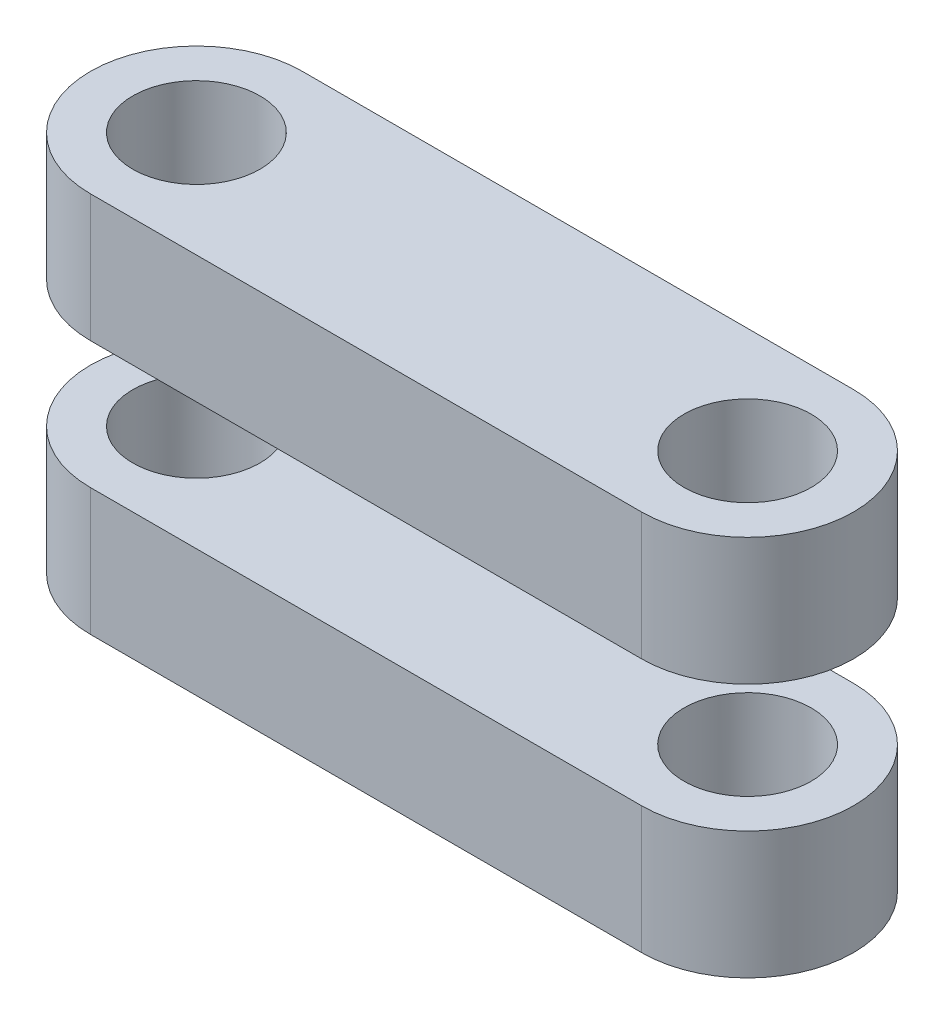
ISO-10303-21;
HEADER;
FILE_DESCRIPTION(('STEP AP214'),'2;1');
FILE_NAME('part.step','',(''),(''),'','','');
FILE_SCHEMA(('AUTOMOTIVE_DESIGN { 1 0 10303 214 1 1 1 1 }'));
ENDSEC;
DATA;
#1=APPLICATION_CONTEXT('core data for automotive mechanical design processes');
#2=APPLICATION_PROTOCOL_DEFINITION('international standard','automotive_design',2000,#1);
#3=PRODUCT_CONTEXT('',#1,'mechanical');
#4=PRODUCT('Part','Part','',(#3));
#5=PRODUCT_RELATED_PRODUCT_CATEGORY('part','',(#4));
#6=PRODUCT_DEFINITION_FORMATION('','',#4);
#7=PRODUCT_DEFINITION_CONTEXT('part definition',#1,'design');
#8=PRODUCT_DEFINITION('design','',#6,#7);
#9=PRODUCT_DEFINITION_SHAPE('','',#8);
#10=(LENGTH_UNIT() NAMED_UNIT(*) SI_UNIT(.MILLI.,.METRE.));
#11=(NAMED_UNIT(*) PLANE_ANGLE_UNIT() SI_UNIT($,.RADIAN.));
#12=(NAMED_UNIT(*) SI_UNIT($,.STERADIAN.) SOLID_ANGLE_UNIT());
#13=UNCERTAINTY_MEASURE_WITH_UNIT(LENGTH_MEASURE(1.E-05),#10,'distance_accuracy_value','');
#14=(GEOMETRIC_REPRESENTATION_CONTEXT(3) GLOBAL_UNCERTAINTY_ASSIGNED_CONTEXT((#13)) GLOBAL_UNIT_ASSIGNED_CONTEXT((#10,
#11,#12)) REPRESENTATION_CONTEXT('',''));
#15=CARTESIAN_POINT('',(0.,0.,0.));
#16=DIRECTION('',(0.,0.,1.));
#17=DIRECTION('',(1.,0.,0.));
#18=AXIS2_PLACEMENT_3D('',#15,#16,#17);
#19=CARTESIAN_POINT('',(0.,9.,-2.5));
#20=DIRECTION('',(0.,0.,1.));
#21=DIRECTION('',(1.,0.,0.));
#22=AXIS2_PLACEMENT_3D('',#19,#20,#21);
#23=PLANE('',#22);
#24=DIRECTION('',(0.,-1.,0.));
#25=VECTOR('',#24,1.);
#26=CARTESIAN_POINT('',(13.,9.,-2.5));
#27=LINE('',#26,#25);
#28=CARTESIAN_POINT('',(13.,9.,-2.5));
#29=VERTEX_POINT('',#28);
#30=CARTESIAN_POINT('',(13.,6.,-2.5));
#31=VERTEX_POINT('',#30);
#32=EDGE_CURVE('E100',#29,#31,#27,.T.);
#33=ORIENTED_EDGE('',*,*,#32,.T.);
#34=DIRECTION('',(-1.,0.,0.));
#35=VECTOR('',#34,1.);
#36=CARTESIAN_POINT('',(12.,6.,-2.5));
#37=LINE('',#36,#35);
#38=CARTESIAN_POINT('',(0.,6.,-2.5));
#39=VERTEX_POINT('',#38);
#40=EDGE_CURVE('E67',#31,#39,#37,.T.);
#41=ORIENTED_EDGE('',*,*,#40,.T.);
#42=DIRECTION('',(0.,-1.,0.));
#43=VECTOR('',#42,1.);
#44=CARTESIAN_POINT('',(0.,9.,-2.5));
#45=LINE('',#44,#43);
#46=CARTESIAN_POINT('',(0.,9.,-2.5));
#47=VERTEX_POINT('',#46);
#48=EDGE_CURVE('E106',#47,#39,#45,.T.);
#49=ORIENTED_EDGE('',*,*,#48,.F.);
#50=DIRECTION('',(-1.,0.,0.));
#51=VECTOR('',#50,1.);
#52=CARTESIAN_POINT('',(0.,9.,-2.5));
#53=LINE('',#52,#51);
#54=EDGE_CURVE('E108',#29,#47,#53,.T.);
#55=ORIENTED_EDGE('',*,*,#54,.F.);
#56=EDGE_LOOP('',(#33,#41,#49,#55));
#57=FACE_BOUND('',#56,.T.);
#58=ADVANCED_FACE('F50',(#57),#23,.F.);
#59=CARTESIAN_POINT('',(13.,9.,2.5));
#60=DIRECTION('',(0.,0.,-1.));
#61=DIRECTION('',(-1.,0.,0.));
#62=AXIS2_PLACEMENT_3D('',#59,#60,#61);
#63=PLANE('',#62);
#64=DIRECTION('',(1.,0.,0.));
#65=VECTOR('',#64,1.);
#66=CARTESIAN_POINT('',(3.,6.,2.5));
#67=LINE('',#66,#65);
#68=CARTESIAN_POINT('',(0.,6.,2.5));
#69=VERTEX_POINT('',#68);
#70=CARTESIAN_POINT('',(13.,6.,2.5));
#71=VERTEX_POINT('',#70);
#72=EDGE_CURVE('E89',#69,#71,#67,.T.);
#73=ORIENTED_EDGE('',*,*,#72,.T.);
#74=DIRECTION('',(0.,-1.,0.));
#75=VECTOR('',#74,1.);
#76=CARTESIAN_POINT('',(13.,9.,2.5));
#77=LINE('',#76,#75);
#78=CARTESIAN_POINT('',(13.,9.,2.5));
#79=VERTEX_POINT('',#78);
#80=EDGE_CURVE('E53',#79,#71,#77,.T.);
#81=ORIENTED_EDGE('',*,*,#80,.F.);
#82=DIRECTION('',(1.,0.,0.));
#83=VECTOR('',#82,1.);
#84=CARTESIAN_POINT('',(13.,9.,2.5));
#85=LINE('',#84,#83);
#86=CARTESIAN_POINT('',(0.,9.,2.5));
#87=VERTEX_POINT('',#86);
#88=EDGE_CURVE('E124',#87,#79,#85,.T.);
#89=ORIENTED_EDGE('',*,*,#88,.F.);
#90=DIRECTION('',(0.,-1.,0.));
#91=VECTOR('',#90,1.);
#92=CARTESIAN_POINT('',(0.,9.,2.5));
#93=LINE('',#92,#91);
#94=EDGE_CURVE('E111',#87,#69,#93,.T.);
#95=ORIENTED_EDGE('',*,*,#94,.T.);
#96=EDGE_LOOP('',(#73,#81,#89,#95));
#97=FACE_BOUND('',#96,.T.);
#98=ADVANCED_FACE('F140',(#97),#63,.F.);
#99=CARTESIAN_POINT('',(16.,6.,2.5));
#100=DIRECTION('',(0.,1.,0.));
#101=DIRECTION('',(0.,0.,1.));
#102=AXIS2_PLACEMENT_3D('',#99,#100,#101);
#103=PLANE('',#102);
#104=CARTESIAN_POINT('',(13.,6.,0.));
#105=DIRECTION('',(0.,1.,0.));
#106=DIRECTION('',(0.,0.,1.));
#107=AXIS2_PLACEMENT_3D('',#104,#105,#106);
#108=CIRCLE('',#107,1.5);
#109=CARTESIAN_POINT('',(13.,6.,1.5));
#110=VERTEX_POINT('',#109);
#111=EDGE_CURVE('E114',#110,#110,#108,.T.);
#112=ORIENTED_EDGE('',*,*,#111,.T.);
#113=EDGE_LOOP('',(#112));
#114=FACE_BOUND('',#113,.T.);
#115=ORIENTED_EDGE('',*,*,#40,.F.);
#116=CARTESIAN_POINT('',(13.,6.,0.));
#117=DIRECTION('',(0.,1.,0.));
#118=DIRECTION('',(0.,0.,1.));
#119=AXIS2_PLACEMENT_3D('',#116,#117,#118);
#120=CIRCLE('',#119,2.5);
#121=EDGE_CURVE('E95',#71,#31,#120,.T.);
#122=ORIENTED_EDGE('',*,*,#121,.F.);
#123=ORIENTED_EDGE('',*,*,#72,.F.);
#124=CARTESIAN_POINT('',(0.,6.,0.));
#125=DIRECTION('',(0.,1.,0.));
#126=DIRECTION('',(0.,0.,1.));
#127=AXIS2_PLACEMENT_3D('',#124,#125,#126);
#128=CIRCLE('',#127,2.5);
#129=EDGE_CURVE('E98',#39,#69,#128,.T.);
#130=ORIENTED_EDGE('',*,*,#129,.F.);
#131=EDGE_LOOP('',(#115,#122,#123,#130));
#132=FACE_BOUND('',#131,.T.);
#133=CARTESIAN_POINT('',(0.,6.,0.));
#134=DIRECTION('',(0.,1.,0.));
#135=DIRECTION('',(0.,0.,1.));
#136=AXIS2_PLACEMENT_3D('',#133,#134,#135);
#137=CIRCLE('',#136,1.5);
#138=CARTESIAN_POINT('',(0.,6.,1.5));
#139=VERTEX_POINT('',#138);
#140=EDGE_CURVE('E12',#139,#139,#137,.T.);
#141=ORIENTED_EDGE('',*,*,#140,.T.);
#142=EDGE_LOOP('',(#141));
#143=FACE_BOUND('',#142,.T.);
#144=ADVANCED_FACE('F93',(#114,#132,#143),#103,.F.);
#145=CARTESIAN_POINT('',(13.,9.,0.));
#146=DIRECTION('',(0.,1.,0.));
#147=DIRECTION('',(0.,0.,1.));
#148=AXIS2_PLACEMENT_3D('',#145,#146,#147);
#149=PLANE('',#148);
#150=CARTESIAN_POINT('',(0.,9.,0.));
#151=DIRECTION('',(0.,1.,0.));
#152=DIRECTION('',(0.,0.,1.));
#153=AXIS2_PLACEMENT_3D('',#150,#151,#152);
#154=CIRCLE('',#153,1.5);
#155=CARTESIAN_POINT('',(0.,9.,1.5));
#156=VERTEX_POINT('',#155);
#157=EDGE_CURVE('E129',#156,#156,#154,.T.);
#158=ORIENTED_EDGE('',*,*,#157,.F.);
#159=EDGE_LOOP('',(#158));
#160=FACE_BOUND('',#159,.T.);
#161=CARTESIAN_POINT('',(13.,9.,0.));
#162=DIRECTION('',(0.,1.,0.));
#163=DIRECTION('',(0.,0.,1.));
#164=AXIS2_PLACEMENT_3D('',#161,#162,#163);
#165=CIRCLE('',#164,2.5);
#166=EDGE_CURVE('E118',#79,#29,#165,.T.);
#167=ORIENTED_EDGE('',*,*,#166,.T.);
#168=ORIENTED_EDGE('',*,*,#54,.T.);
#169=CARTESIAN_POINT('',(0.,9.,0.));
#170=DIRECTION('',(0.,1.,0.));
#171=DIRECTION('',(0.,0.,1.));
#172=AXIS2_PLACEMENT_3D('',#169,#170,#171);
#173=CIRCLE('',#172,2.5);
#174=EDGE_CURVE('E126',#47,#87,#173,.T.);
#175=ORIENTED_EDGE('',*,*,#174,.T.);
#176=ORIENTED_EDGE('',*,*,#88,.T.);
#177=EDGE_LOOP('',(#167,#168,#175,#176));
#178=FACE_BOUND('',#177,.T.);
#179=CARTESIAN_POINT('',(13.,9.,0.));
#180=DIRECTION('',(0.,1.,0.));
#181=DIRECTION('',(0.,0.,1.));
#182=AXIS2_PLACEMENT_3D('',#179,#180,#181);
#183=CIRCLE('',#182,1.5);
#184=CARTESIAN_POINT('',(13.,9.,1.5));
#185=VERTEX_POINT('',#184);
#186=EDGE_CURVE('E59',#185,#185,#183,.T.);
#187=ORIENTED_EDGE('',*,*,#186,.F.);
#188=EDGE_LOOP('',(#187));
#189=FACE_BOUND('',#188,.T.);
#190=ADVANCED_FACE('F138',(#160,#178,#189),#149,.T.);
#191=CARTESIAN_POINT('',(13.,9.,0.));
#192=DIRECTION('',(0.,-1.,0.));
#193=DIRECTION('',(0.,0.,-1.));
#194=AXIS2_PLACEMENT_3D('',#191,#192,#193);
#195=CYLINDRICAL_SURFACE('',#194,2.5);
#196=ORIENTED_EDGE('',*,*,#80,.T.);
#197=ORIENTED_EDGE('',*,*,#121,.T.);
#198=ORIENTED_EDGE('',*,*,#32,.F.);
#199=ORIENTED_EDGE('',*,*,#166,.F.);
#200=EDGE_LOOP('',(#196,#197,#198,#199));
#201=FACE_BOUND('',#200,.T.);
#202=ADVANCED_FACE('F104',(#201),#195,.T.);
#203=CARTESIAN_POINT('',(0.,9.,0.));
#204=DIRECTION('',(0.,-1.,0.));
#205=DIRECTION('',(0.,0.,-1.));
#206=AXIS2_PLACEMENT_3D('',#203,#204,#205);
#207=CYLINDRICAL_SURFACE('',#206,2.5);
#208=ORIENTED_EDGE('',*,*,#48,.T.);
#209=ORIENTED_EDGE('',*,*,#129,.T.);
#210=ORIENTED_EDGE('',*,*,#94,.F.);
#211=ORIENTED_EDGE('',*,*,#174,.F.);
#212=EDGE_LOOP('',(#208,#209,#210,#211));
#213=FACE_BOUND('',#212,.T.);
#214=ADVANCED_FACE('F135',(#213),#207,.T.);
#215=CARTESIAN_POINT('',(0.,9.,0.));
#216=DIRECTION('',(0.,-1.,0.));
#217=DIRECTION('',(0.,0.,-1.));
#218=AXIS2_PLACEMENT_3D('',#215,#216,#217);
#219=CYLINDRICAL_SURFACE('',#218,1.5);
#220=ORIENTED_EDGE('',*,*,#140,.F.);
#221=EDGE_LOOP('',(#220));
#222=FACE_BOUND('',#221,.T.);
#223=ORIENTED_EDGE('',*,*,#157,.T.);
#224=EDGE_LOOP('',(#223));
#225=FACE_BOUND('',#224,.T.);
#226=ADVANCED_FACE('F151',(#222,#225),#219,.F.);
#227=CARTESIAN_POINT('',(13.,9.,0.));
#228=DIRECTION('',(0.,-1.,0.));
#229=DIRECTION('',(0.,0.,-1.));
#230=AXIS2_PLACEMENT_3D('',#227,#228,#229);
#231=CYLINDRICAL_SURFACE('',#230,1.5);
#232=ORIENTED_EDGE('',*,*,#111,.F.);
#233=EDGE_LOOP('',(#232));
#234=FACE_BOUND('',#233,.T.);
#235=ORIENTED_EDGE('',*,*,#186,.T.);
#236=EDGE_LOOP('',(#235));
#237=FACE_BOUND('',#236,.T.);
#238=ADVANCED_FACE('F148',(#234,#237),#231,.F.);
#239=CLOSED_SHELL('',(#58,#98,#144,#190,#202,#214,#226,#238));
#240=MANIFOLD_SOLID_BREP('B2',#239);
#241=CARTESIAN_POINT('',(13.,9.,0.));
#242=DIRECTION('',(0.,-1.,0.));
#243=DIRECTION('',(0.,0.,-1.));
#244=AXIS2_PLACEMENT_3D('',#241,#242,#243);
#245=CYLINDRICAL_SURFACE('',#244,2.5);
#246=DIRECTION('',(0.,-1.,0.));
#247=VECTOR('',#246,1.);
#248=CARTESIAN_POINT('',(13.,9.,-2.5));
#249=LINE('',#248,#247);
#250=CARTESIAN_POINT('',(13.,3.,-2.5));
#251=VERTEX_POINT('',#250);
#252=CARTESIAN_POINT('',(13.,0.,-2.5));
#253=VERTEX_POINT('',#252);
#254=EDGE_CURVE('E48',#251,#253,#249,.T.);
#255=ORIENTED_EDGE('',*,*,#254,.F.);
#256=CARTESIAN_POINT('',(13.,3.,0.));
#257=DIRECTION('',(0.,-1.,0.));
#258=DIRECTION('',(0.,0.,-1.));
#259=AXIS2_PLACEMENT_3D('',#256,#257,#258);
#260=CIRCLE('',#259,2.5);
#261=CARTESIAN_POINT('',(13.,3.,2.5));
#262=VERTEX_POINT('',#261);
#263=EDGE_CURVE('E263',#251,#262,#260,.T.);
#264=ORIENTED_EDGE('',*,*,#263,.T.);
#265=DIRECTION('',(0.,-1.,0.));
#266=VECTOR('',#265,1.);
#267=CARTESIAN_POINT('',(13.,9.,2.5));
#268=LINE('',#267,#266);
#269=CARTESIAN_POINT('',(13.,0.,2.5));
#270=VERTEX_POINT('',#269);
#271=EDGE_CURVE('E238',#262,#270,#268,.T.);
#272=ORIENTED_EDGE('',*,*,#271,.T.);
#273=CARTESIAN_POINT('',(13.,0.,0.));
#274=DIRECTION('',(0.,1.,0.));
#275=DIRECTION('',(0.,0.,1.));
#276=AXIS2_PLACEMENT_3D('',#273,#274,#275);
#277=CIRCLE('',#276,2.5);
#278=EDGE_CURVE('E283',#270,#253,#277,.T.);
#279=ORIENTED_EDGE('',*,*,#278,.T.);
#280=EDGE_LOOP('',(#255,#264,#272,#279));
#281=FACE_BOUND('',#280,.T.);
#282=ADVANCED_FACE('F221',(#281),#245,.T.);
#283=CARTESIAN_POINT('',(13.,0.,0.));
#284=DIRECTION('',(0.,1.,0.));
#285=DIRECTION('',(0.,0.,1.));
#286=AXIS2_PLACEMENT_3D('',#283,#284,#285);
#287=PLANE('',#286);
#288=ORIENTED_EDGE('',*,*,#278,.F.);
#289=DIRECTION('',(1.,0.,0.));
#290=VECTOR('',#289,1.);
#291=CARTESIAN_POINT('',(13.,0.,2.5));
#292=LINE('',#291,#290);
#293=CARTESIAN_POINT('',(0.,0.,2.5));
#294=VERTEX_POINT('',#293);
#295=EDGE_CURVE('E301',#294,#270,#292,.T.);
#296=ORIENTED_EDGE('',*,*,#295,.F.);
#297=CARTESIAN_POINT('',(0.,0.,0.));
#298=DIRECTION('',(0.,1.,0.));
#299=DIRECTION('',(0.,0.,1.));
#300=AXIS2_PLACEMENT_3D('',#297,#298,#299);
#301=CIRCLE('',#300,2.5);
#302=CARTESIAN_POINT('',(0.,0.,-2.5));
#303=VERTEX_POINT('',#302);
#304=EDGE_CURVE('E292',#303,#294,#301,.T.);
#305=ORIENTED_EDGE('',*,*,#304,.F.);
#306=DIRECTION('',(-1.,0.,0.));
#307=VECTOR('',#306,1.);
#308=CARTESIAN_POINT('',(0.,0.,-2.5));
#309=LINE('',#308,#307);
#310=EDGE_CURVE('E287',#253,#303,#309,.T.);
#311=ORIENTED_EDGE('',*,*,#310,.F.);
#312=EDGE_LOOP('',(#288,#296,#305,#311));
#313=FACE_BOUND('',#312,.T.);
#314=CARTESIAN_POINT('',(0.,0.,0.));
#315=DIRECTION('',(0.,1.,0.));
#316=DIRECTION('',(0.,0.,1.));
#317=AXIS2_PLACEMENT_3D('',#314,#315,#316);
#318=CIRCLE('',#317,1.5);
#319=CARTESIAN_POINT('',(0.,0.,1.5));
#320=VERTEX_POINT('',#319);
#321=EDGE_CURVE('E288',#320,#320,#318,.T.);
#322=ORIENTED_EDGE('',*,*,#321,.T.);
#323=EDGE_LOOP('',(#322));
#324=FACE_BOUND('',#323,.T.);
#325=CARTESIAN_POINT('',(13.,0.,0.));
#326=DIRECTION('',(0.,1.,0.));
#327=DIRECTION('',(0.,0.,1.));
#328=AXIS2_PLACEMENT_3D('',#325,#326,#327);
#329=CIRCLE('',#328,1.5);
#330=CARTESIAN_POINT('',(13.,0.,1.5));
#331=VERTEX_POINT('',#330);
#332=EDGE_CURVE('E295',#331,#331,#329,.T.);
#333=ORIENTED_EDGE('',*,*,#332,.T.);
#334=EDGE_LOOP('',(#333));
#335=FACE_BOUND('',#334,.T.);
#336=ADVANCED_FACE('F322',(#313,#324,#335),#287,.F.);
#337=CARTESIAN_POINT('',(0.,9.,0.));
#338=DIRECTION('',(0.,-1.,0.));
#339=DIRECTION('',(0.,0.,-1.));
#340=AXIS2_PLACEMENT_3D('',#337,#338,#339);
#341=CYLINDRICAL_SURFACE('',#340,2.5);
#342=DIRECTION('',(0.,-1.,0.));
#343=VECTOR('',#342,1.);
#344=CARTESIAN_POINT('',(0.,9.,2.5));
#345=LINE('',#344,#343);
#346=CARTESIAN_POINT('',(0.,3.,2.5));
#347=VERTEX_POINT('',#346);
#348=EDGE_CURVE('E245',#347,#294,#345,.T.);
#349=ORIENTED_EDGE('',*,*,#348,.F.);
#350=CARTESIAN_POINT('',(0.,3.,0.));
#351=DIRECTION('',(0.,-1.,0.));
#352=DIRECTION('',(0.,0.,-1.));
#353=AXIS2_PLACEMENT_3D('',#350,#351,#352);
#354=CIRCLE('',#353,2.5);
#355=CARTESIAN_POINT('',(0.,3.,-2.5));
#356=VERTEX_POINT('',#355);
#357=EDGE_CURVE('E316',#347,#356,#354,.T.);
#358=ORIENTED_EDGE('',*,*,#357,.T.);
#359=DIRECTION('',(0.,-1.,0.));
#360=VECTOR('',#359,1.);
#361=CARTESIAN_POINT('',(0.,9.,-2.5));
#362=LINE('',#361,#360);
#363=EDGE_CURVE('E230',#356,#303,#362,.T.);
#364=ORIENTED_EDGE('',*,*,#363,.T.);
#365=ORIENTED_EDGE('',*,*,#304,.T.);
#366=EDGE_LOOP('',(#349,#358,#364,#365));
#367=FACE_BOUND('',#366,.T.);
#368=ADVANCED_FACE('F335',(#367),#341,.T.);
#369=CARTESIAN_POINT('',(0.,9.,0.));
#370=DIRECTION('',(0.,-1.,0.));
#371=DIRECTION('',(0.,0.,-1.));
#372=AXIS2_PLACEMENT_3D('',#369,#370,#371);
#373=CYLINDRICAL_SURFACE('',#372,1.5);
#374=CARTESIAN_POINT('',(0.,3.,0.));
#375=DIRECTION('',(0.,-1.,0.));
#376=DIRECTION('',(0.,0.,-1.));
#377=AXIS2_PLACEMENT_3D('',#374,#375,#376);
#378=CIRCLE('',#377,1.5);
#379=CARTESIAN_POINT('',(0.,3.,-1.5));
#380=VERTEX_POINT('',#379);
#381=EDGE_CURVE('E224',#380,#380,#378,.T.);
#382=ORIENTED_EDGE('',*,*,#381,.F.);
#383=EDGE_LOOP('',(#382));
#384=FACE_BOUND('',#383,.T.);
#385=ORIENTED_EDGE('',*,*,#321,.F.);
#386=EDGE_LOOP('',(#385));
#387=FACE_BOUND('',#386,.T.);
#388=ADVANCED_FACE('F326',(#384,#387),#373,.F.);
#389=CARTESIAN_POINT('',(13.,9.,0.));
#390=DIRECTION('',(0.,-1.,0.));
#391=DIRECTION('',(0.,0.,-1.));
#392=AXIS2_PLACEMENT_3D('',#389,#390,#391);
#393=CYLINDRICAL_SURFACE('',#392,1.5);
#394=CARTESIAN_POINT('',(13.,3.,0.));
#395=DIRECTION('',(0.,-1.,0.));
#396=DIRECTION('',(0.,0.,-1.));
#397=AXIS2_PLACEMENT_3D('',#394,#395,#396);
#398=CIRCLE('',#397,1.5);
#399=CARTESIAN_POINT('',(13.,3.,-1.5));
#400=VERTEX_POINT('',#399);
#401=EDGE_CURVE('E273',#400,#400,#398,.T.);
#402=ORIENTED_EDGE('',*,*,#401,.F.);
#403=EDGE_LOOP('',(#402));
#404=FACE_BOUND('',#403,.T.);
#405=ORIENTED_EDGE('',*,*,#332,.F.);
#406=EDGE_LOOP('',(#405));
#407=FACE_BOUND('',#406,.T.);
#408=ADVANCED_FACE('F324',(#404,#407),#393,.F.);
#409=CARTESIAN_POINT('',(16.,3.,2.5));
#410=DIRECTION('',(0.,-1.,0.));
#411=DIRECTION('',(0.,0.,-1.));
#412=AXIS2_PLACEMENT_3D('',#409,#410,#411);
#413=PLANE('',#412);
#414=ORIENTED_EDGE('',*,*,#401,.T.);
#415=EDGE_LOOP('',(#414));
#416=FACE_BOUND('',#415,.T.);
#417=DIRECTION('',(-1.,0.,0.));
#418=VECTOR('',#417,1.);
#419=CARTESIAN_POINT('',(16.,3.,-2.5));
#420=LINE('',#419,#418);
#421=EDGE_CURVE('E268',#251,#356,#420,.T.);
#422=ORIENTED_EDGE('',*,*,#421,.T.);
#423=ORIENTED_EDGE('',*,*,#357,.F.);
#424=DIRECTION('',(-1.,0.,0.));
#425=VECTOR('',#424,1.);
#426=CARTESIAN_POINT('',(16.,3.,2.5));
#427=LINE('',#426,#425);
#428=EDGE_CURVE('E270',#262,#347,#427,.T.);
#429=ORIENTED_EDGE('',*,*,#428,.F.);
#430=ORIENTED_EDGE('',*,*,#263,.F.);
#431=EDGE_LOOP('',(#422,#423,#429,#430));
#432=FACE_BOUND('',#431,.T.);
#433=ORIENTED_EDGE('',*,*,#381,.T.);
#434=EDGE_LOOP('',(#433));
#435=FACE_BOUND('',#434,.T.);
#436=ADVANCED_FACE('F265',(#416,#432,#435),#413,.F.);
#437=CARTESIAN_POINT('',(13.,9.,2.5));
#438=DIRECTION('',(0.,0.,-1.));
#439=DIRECTION('',(-1.,0.,0.));
#440=AXIS2_PLACEMENT_3D('',#437,#438,#439);
#441=PLANE('',#440);
#442=ORIENTED_EDGE('',*,*,#428,.T.);
#443=ORIENTED_EDGE('',*,*,#348,.T.);
#444=ORIENTED_EDGE('',*,*,#295,.T.);
#445=ORIENTED_EDGE('',*,*,#271,.F.);
#446=EDGE_LOOP('',(#442,#443,#444,#445));
#447=FACE_BOUND('',#446,.T.);
#448=ADVANCED_FACE('F333',(#447),#441,.F.);
#449=CARTESIAN_POINT('',(0.,9.,-2.5));
#450=DIRECTION('',(0.,0.,1.));
#451=DIRECTION('',(1.,0.,0.));
#452=AXIS2_PLACEMENT_3D('',#449,#450,#451);
#453=PLANE('',#452);
#454=ORIENTED_EDGE('',*,*,#363,.F.);
#455=ORIENTED_EDGE('',*,*,#421,.F.);
#456=ORIENTED_EDGE('',*,*,#254,.T.);
#457=ORIENTED_EDGE('',*,*,#310,.T.);
#458=EDGE_LOOP('',(#454,#455,#456,#457));
#459=FACE_BOUND('',#458,.T.);
#460=ADVANCED_FACE('F277',(#459),#453,.F.);
#461=CLOSED_SHELL('',(#282,#336,#368,#388,#408,#436,#448,#460));
#462=MANIFOLD_SOLID_BREP('B6',#461);
#463=ADVANCED_BREP_SHAPE_REPRESENTATION('',(#18,#240,#462),#14);
#464=SHAPE_DEFINITION_REPRESENTATION(#9,#463);
ENDSEC;
END-ISO-10303-21;
